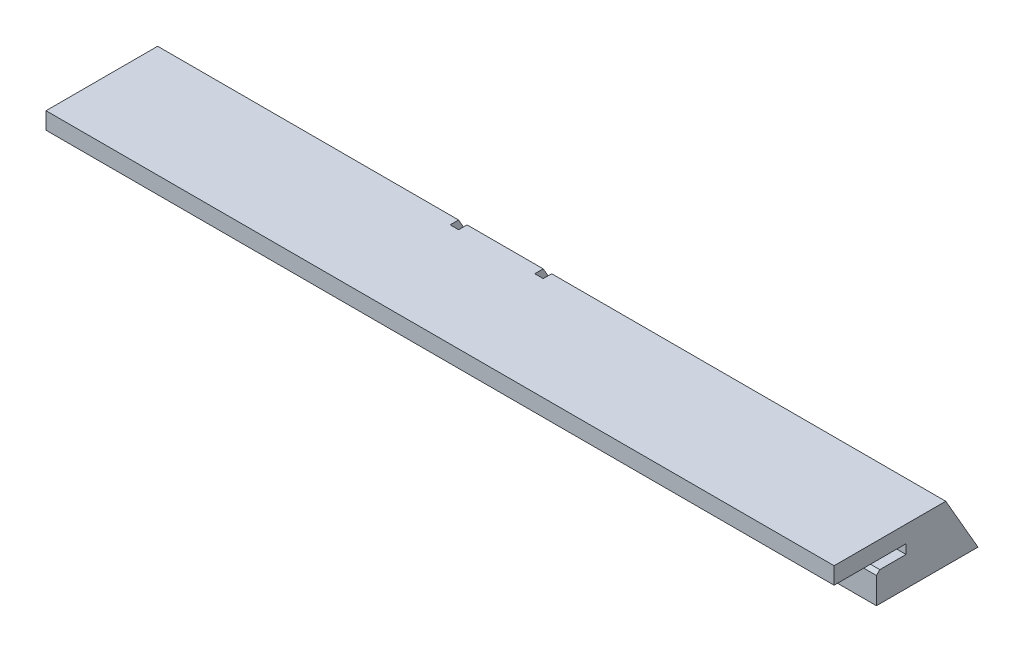
ISO-10303-21;
HEADER;
FILE_DESCRIPTION(('STEP AP214'),'2;1');
FILE_NAME('part.step','',(''),(''),'','','');
FILE_SCHEMA(('AUTOMOTIVE_DESIGN { 1 0 10303 214 1 1 1 1 }'));
ENDSEC;
DATA;
#1=APPLICATION_CONTEXT('core data for automotive mechanical design processes');
#2=APPLICATION_PROTOCOL_DEFINITION('international standard','automotive_design',2000,#1);
#3=PRODUCT_CONTEXT('',#1,'mechanical');
#4=PRODUCT('Part','Part','',(#3));
#5=PRODUCT_RELATED_PRODUCT_CATEGORY('part','',(#4));
#6=PRODUCT_DEFINITION_FORMATION('','',#4);
#7=PRODUCT_DEFINITION_CONTEXT('part definition',#1,'design');
#8=PRODUCT_DEFINITION('design','',#6,#7);
#9=PRODUCT_DEFINITION_SHAPE('','',#8);
#10=(LENGTH_UNIT() NAMED_UNIT(*) SI_UNIT(.MILLI.,.METRE.));
#11=(NAMED_UNIT(*) PLANE_ANGLE_UNIT() SI_UNIT($,.RADIAN.));
#12=(NAMED_UNIT(*) SI_UNIT($,.STERADIAN.) SOLID_ANGLE_UNIT());
#13=UNCERTAINTY_MEASURE_WITH_UNIT(LENGTH_MEASURE(1.E-05),#10,'distance_accuracy_value','');
#14=(GEOMETRIC_REPRESENTATION_CONTEXT(3) GLOBAL_UNCERTAINTY_ASSIGNED_CONTEXT((#13)) GLOBAL_UNIT_ASSIGNED_CONTEXT((#10,
#11,#12)) REPRESENTATION_CONTEXT('',''));
#15=CARTESIAN_POINT('',(0.,0.,0.));
#16=DIRECTION('',(0.,0.,1.));
#17=DIRECTION('',(1.,0.,0.));
#18=AXIS2_PLACEMENT_3D('',#15,#16,#17);
#19=CARTESIAN_POINT('',(0.,4.33012701892216,-9.50000000000006));
#20=DIRECTION('',(0.,0.499999999999995,-0.866025403784442));
#21=DIRECTION('',(0.,0.866025403784442,0.499999999999995));
#22=AXIS2_PLACEMENT_3D('',#19,#20,#21);
#23=PLANE('',#22);
#24=DIRECTION('',(0.,-0.866025403784442,-0.499999999999995));
#25=VECTOR('',#24,1.);
#26=CARTESIAN_POINT('',(46.55,6.6,-8.18948822334853));
#27=LINE('',#26,#25);
#28=CARTESIAN_POINT('',(46.55,6.6,-8.18948822334853));
#29=VERTEX_POINT('',#28);
#30=CARTESIAN_POINT('',(46.55,0.,-12.));
#31=VERTEX_POINT('',#30);
#32=EDGE_CURVE('E209',#29,#31,#27,.T.);
#33=ORIENTED_EDGE('',*,*,#32,.F.);
#34=DIRECTION('',(1.,0.,0.));
#35=VECTOR('',#34,1.);
#36=CARTESIAN_POINT('',(0.,6.6,-8.18948822334853));
#37=LINE('',#36,#35);
#38=CARTESIAN_POINT('',(93.1,6.6,-8.18948822334853));
#39=VERTEX_POINT('',#38);
#40=EDGE_CURVE('E271',#29,#39,#37,.T.);
#41=ORIENTED_EDGE('',*,*,#40,.T.);
#42=DIRECTION('',(0.,-0.866025403784442,-0.499999999999995));
#43=VECTOR('',#42,1.);
#44=CARTESIAN_POINT('',(93.1,6.6,-8.18948822334853));
#45=LINE('',#44,#43);
#46=CARTESIAN_POINT('',(93.1,0.,-12.));
#47=VERTEX_POINT('',#46);
#48=EDGE_CURVE('E275',#39,#47,#45,.T.);
#49=ORIENTED_EDGE('',*,*,#48,.T.);
#50=DIRECTION('',(-1.,0.,0.));
#51=VECTOR('',#50,1.);
#52=CARTESIAN_POINT('',(93.1,0.,-12.));
#53=LINE('',#52,#51);
#54=EDGE_CURVE('E265',#47,#31,#53,.T.);
#55=ORIENTED_EDGE('',*,*,#54,.T.);
#56=EDGE_LOOP('',(#33,#41,#49,#55));
#57=FACE_BOUND('',#56,.T.);
#58=ADVANCED_FACE('F43',(#57),#23,.T.);
#59=DIRECTION('',(0.,0.866025403784442,0.499999999999995));
#60=VECTOR('',#59,1.);
#61=CARTESIAN_POINT('',(35.55,6.60000000000001,-8.18948822334853));
#62=LINE('',#61,#60);
#63=CARTESIAN_POINT('',(35.55,0.,-12.));
#64=VERTEX_POINT('',#63);
#65=CARTESIAN_POINT('',(35.55,6.60000000000001,-8.18948822334853));
#66=VERTEX_POINT('',#65);
#67=EDGE_CURVE('E252',#64,#66,#62,.T.);
#68=ORIENTED_EDGE('',*,*,#67,.F.);
#69=CARTESIAN_POINT('',(0.,0.,-12.));
#70=VERTEX_POINT('',#69);
#71=EDGE_CURVE('E237',#64,#70,#53,.T.);
#72=ORIENTED_EDGE('',*,*,#71,.T.);
#73=DIRECTION('',(0.,0.866025403784442,0.499999999999995));
#74=VECTOR('',#73,1.);
#75=CARTESIAN_POINT('',(0.,0.,-12.));
#76=LINE('',#75,#74);
#77=CARTESIAN_POINT('',(0.,6.6,-8.18948822334853));
#78=VERTEX_POINT('',#77);
#79=EDGE_CURVE('E267',#70,#78,#76,.T.);
#80=ORIENTED_EDGE('',*,*,#79,.T.);
#81=EDGE_CURVE('E272',#78,#66,#37,.T.);
#82=ORIENTED_EDGE('',*,*,#81,.T.);
#83=EDGE_LOOP('',(#68,#72,#80,#82));
#84=FACE_BOUND('',#83,.T.);
#85=ADVANCED_FACE('F454',(#84),#23,.T.);
#86=CARTESIAN_POINT('',(0.,3.5,0.));
#87=DIRECTION('',(0.,0.,-1.));
#88=DIRECTION('',(-1.,0.,0.));
#89=AXIS2_PLACEMENT_3D('',#86,#87,#88);
#90=PLANE('',#89);
#91=DIRECTION('',(0.,-1.,0.));
#92=VECTOR('',#91,1.);
#93=CARTESIAN_POINT('',(88.1,4.6,0.));
#94=LINE('',#93,#92);
#95=CARTESIAN_POINT('',(88.1,4.6,0.));
#96=VERTEX_POINT('',#95);
#97=CARTESIAN_POINT('',(88.1,3.1,0.));
#98=VERTEX_POINT('',#97);
#99=EDGE_CURVE('E304',#96,#98,#94,.T.);
#100=ORIENTED_EDGE('',*,*,#99,.F.);
#101=DIRECTION('',(1.,0.,0.));
#102=VECTOR('',#101,1.);
#103=CARTESIAN_POINT('',(0.,4.6,0.));
#104=LINE('',#103,#102);
#105=CARTESIAN_POINT('',(76.399623113199,4.6,0.));
#106=VERTEX_POINT('',#105);
#107=EDGE_CURVE('E279',#106,#96,#104,.T.);
#108=ORIENTED_EDGE('',*,*,#107,.F.);
#109=DIRECTION('',(0.,-1.,0.));
#110=VECTOR('',#109,1.);
#111=CARTESIAN_POINT('',(76.399623113199,6.601,0.));
#112=LINE('',#111,#110);
#113=CARTESIAN_POINT('',(76.399623113199,0.,0.));
#114=VERTEX_POINT('',#113);
#115=EDGE_CURVE('E298',#114,#106,#112,.F.);
#116=ORIENTED_EDGE('',*,*,#115,.F.);
#117=DIRECTION('',(1.,0.,0.));
#118=VECTOR('',#117,1.);
#119=CARTESIAN_POINT('',(0.,0.,0.));
#120=LINE('',#119,#118);
#121=CARTESIAN_POINT('',(93.1,0.,0.));
#122=VERTEX_POINT('',#121);
#123=EDGE_CURVE('E356',#114,#122,#120,.T.);
#124=ORIENTED_EDGE('',*,*,#123,.T.);
#125=DIRECTION('',(0.,-1.,0.));
#126=VECTOR('',#125,1.);
#127=CARTESIAN_POINT('',(93.1,3.5,0.));
#128=LINE('',#127,#126);
#129=CARTESIAN_POINT('',(93.1,3.1,0.));
#130=VERTEX_POINT('',#129);
#131=EDGE_CURVE('E353',#130,#122,#128,.T.);
#132=ORIENTED_EDGE('',*,*,#131,.F.);
#133=DIRECTION('',(-1.,0.,0.));
#134=VECTOR('',#133,1.);
#135=CARTESIAN_POINT('',(0.,3.1,0.));
#136=LINE('',#135,#134);
#137=EDGE_CURVE('E368',#130,#98,#136,.T.);
#138=ORIENTED_EDGE('',*,*,#137,.T.);
#139=EDGE_LOOP('',(#100,#108,#116,#124,#132,#138));
#140=FACE_BOUND('',#139,.T.);
#141=ADVANCED_FACE('F413',(#140),#90,.F.);
#142=CARTESIAN_POINT('',(0.,3.5,0.));
#143=DIRECTION('',(0.,-1.,0.));
#144=DIRECTION('',(0.,0.,-1.));
#145=AXIS2_PLACEMENT_3D('',#142,#143,#144);
#146=PLANE('',#145);
#147=DIRECTION('',(0.,0.,-1.));
#148=VECTOR('',#147,1.);
#149=CARTESIAN_POINT('',(88.1,3.5,83.1072800661891));
#150=LINE('',#149,#148);
#151=CARTESIAN_POINT('',(88.1,3.5,-0.399999999999984));
#152=VERTEX_POINT('',#151);
#153=CARTESIAN_POINT('',(88.1,3.5,-3.5));
#154=VERTEX_POINT('',#153);
#155=EDGE_CURVE('E320',#152,#154,#150,.T.);
#156=ORIENTED_EDGE('',*,*,#155,.F.);
#157=DIRECTION('',(1.,0.,0.));
#158=VECTOR('',#157,1.);
#159=CARTESIAN_POINT('',(0.,3.5,-0.399999999999984));
#160=LINE('',#159,#158);
#161=CARTESIAN_POINT('',(93.1,3.5,-0.399999999999984));
#162=VERTEX_POINT('',#161);
#163=EDGE_CURVE('E375',#152,#162,#160,.T.);
#164=ORIENTED_EDGE('',*,*,#163,.T.);
#165=DIRECTION('',(0.,0.,-1.));
#166=VECTOR('',#165,1.);
#167=CARTESIAN_POINT('',(93.1,3.5,0.));
#168=LINE('',#167,#166);
#169=CARTESIAN_POINT('',(93.1,3.5,-3.5));
#170=VERTEX_POINT('',#169);
#171=EDGE_CURVE('E350',#162,#170,#168,.T.);
#172=ORIENTED_EDGE('',*,*,#171,.T.);
#173=DIRECTION('',(1.,0.,0.));
#174=VECTOR('',#173,1.);
#175=CARTESIAN_POINT('',(0.,3.5,-3.5));
#176=LINE('',#175,#174);
#177=EDGE_CURVE('E329',#154,#170,#176,.T.);
#178=ORIENTED_EDGE('',*,*,#177,.F.);
#179=EDGE_LOOP('',(#156,#164,#172,#178));
#180=FACE_BOUND('',#179,.T.);
#181=ADVANCED_FACE('F444',(#180),#146,.F.);
#182=DIRECTION('',(0.,0.,1.));
#183=VECTOR('',#182,1.);
#184=CARTESIAN_POINT('',(0.,3.5,0.));
#185=LINE('',#184,#183);
#186=CARTESIAN_POINT('',(0.,3.5,-3.5));
#187=VERTEX_POINT('',#186);
#188=CARTESIAN_POINT('',(0.,3.5,-0.399999999999984));
#189=VERTEX_POINT('',#188);
#190=EDGE_CURVE('E347',#187,#189,#185,.T.);
#191=ORIENTED_EDGE('',*,*,#190,.T.);
#192=DIRECTION('',(1.,0.,0.));
#193=VECTOR('',#192,1.);
#194=CARTESIAN_POINT('',(0.,3.5,-0.399999999999984));
#195=LINE('',#194,#193);
#196=CARTESIAN_POINT('',(5.,3.5,-0.399999999999984));
#197=VERTEX_POINT('',#196);
#198=EDGE_CURVE('E365',#189,#197,#195,.T.);
#199=ORIENTED_EDGE('',*,*,#198,.T.);
#200=DIRECTION('',(0.,0.,-1.));
#201=VECTOR('',#200,1.);
#202=CARTESIAN_POINT('',(5.,3.5,83.1072800661891));
#203=LINE('',#202,#201);
#204=CARTESIAN_POINT('',(5.,3.5,-3.5));
#205=VERTEX_POINT('',#204);
#206=EDGE_CURVE('E307',#197,#205,#203,.T.);
#207=ORIENTED_EDGE('',*,*,#206,.T.);
#208=EDGE_CURVE('E338',#187,#205,#176,.T.);
#209=ORIENTED_EDGE('',*,*,#208,.F.);
#210=EDGE_LOOP('',(#191,#199,#207,#209));
#211=FACE_BOUND('',#210,.T.);
#212=ADVANCED_FACE('F442',(#211),#146,.F.);
#213=CARTESIAN_POINT('',(0.,4.6,-3.5));
#214=DIRECTION('',(0.,0.,-1.));
#215=DIRECTION('',(-1.,0.,0.));
#216=AXIS2_PLACEMENT_3D('',#213,#214,#215);
#217=PLANE('',#216);
#218=DIRECTION('',(0.,1.,0.));
#219=VECTOR('',#218,1.);
#220=CARTESIAN_POINT('',(88.1,4.6,-3.5));
#221=LINE('',#220,#219);
#222=CARTESIAN_POINT('',(88.1,4.6,-3.5));
#223=VERTEX_POINT('',#222);
#224=EDGE_CURVE('E313',#154,#223,#221,.T.);
#225=ORIENTED_EDGE('',*,*,#224,.F.);
#226=ORIENTED_EDGE('',*,*,#177,.T.);
#227=DIRECTION('',(0.,-1.,0.));
#228=VECTOR('',#227,1.);
#229=CARTESIAN_POINT('',(93.1,4.6,-3.5));
#230=LINE('',#229,#228);
#231=CARTESIAN_POINT('',(93.1,4.6,-3.5));
#232=VERTEX_POINT('',#231);
#233=EDGE_CURVE('E336',#232,#170,#230,.T.);
#234=ORIENTED_EDGE('',*,*,#233,.F.);
#235=DIRECTION('',(1.,0.,0.));
#236=VECTOR('',#235,1.);
#237=CARTESIAN_POINT('',(0.,4.6,-3.5));
#238=LINE('',#237,#236);
#239=EDGE_CURVE('E337',#223,#232,#238,.T.);
#240=ORIENTED_EDGE('',*,*,#239,.F.);
#241=EDGE_LOOP('',(#225,#226,#234,#240));
#242=FACE_BOUND('',#241,.T.);
#243=ADVANCED_FACE('F424',(#242),#217,.F.);
#244=DIRECTION('',(0.,-1.,0.));
#245=VECTOR('',#244,1.);
#246=CARTESIAN_POINT('',(5.,4.6,-3.5));
#247=LINE('',#246,#245);
#248=CARTESIAN_POINT('',(5.,4.6,-3.5));
#249=VERTEX_POINT('',#248);
#250=EDGE_CURVE('E303',#249,#205,#247,.T.);
#251=ORIENTED_EDGE('',*,*,#250,.F.);
#252=CARTESIAN_POINT('',(0.,4.6,-3.5));
#253=VERTEX_POINT('',#252);
#254=EDGE_CURVE('E333',#253,#249,#238,.T.);
#255=ORIENTED_EDGE('',*,*,#254,.F.);
#256=DIRECTION('',(0.,-1.,0.));
#257=VECTOR('',#256,1.);
#258=CARTESIAN_POINT('',(0.,4.6,-3.5));
#259=LINE('',#258,#257);
#260=EDGE_CURVE('E343',#253,#187,#259,.T.);
#261=ORIENTED_EDGE('',*,*,#260,.T.);
#262=ORIENTED_EDGE('',*,*,#208,.T.);
#263=EDGE_LOOP('',(#251,#255,#261,#262));
#264=FACE_BOUND('',#263,.T.);
#265=ADVANCED_FACE('F440',(#264),#217,.F.);
#266=CARTESIAN_POINT('',(0.,4.6,0.));
#267=DIRECTION('',(0.,1.,0.));
#268=DIRECTION('',(0.,0.,1.));
#269=AXIS2_PLACEMENT_3D('',#266,#267,#268);
#270=PLANE('',#269);
#271=DIRECTION('',(0.,0.,-1.));
#272=VECTOR('',#271,1.);
#273=CARTESIAN_POINT('',(5.,4.6,83.1072800661891));
#274=LINE('',#273,#272);
#275=CARTESIAN_POINT('',(5.,4.6,0.));
#276=VERTEX_POINT('',#275);
#277=EDGE_CURVE('E315',#276,#249,#274,.T.);
#278=ORIENTED_EDGE('',*,*,#277,.F.);
#279=CARTESIAN_POINT('',(16.7003768868009,4.6,0.));
#280=VERTEX_POINT('',#279);
#281=EDGE_CURVE('E284',#276,#280,#104,.T.);
#282=ORIENTED_EDGE('',*,*,#281,.T.);
#283=CARTESIAN_POINT('',(46.55,4.6,147.));
#284=DIRECTION('',(0.,-1.,0.));
#285=DIRECTION('',(0.,0.,-1.));
#286=AXIS2_PLACEMENT_3D('',#283,#284,#285);
#287=CIRCLE('',#286,150.);
#288=EDGE_CURVE('E293',#280,#106,#287,.T.);
#289=ORIENTED_EDGE('',*,*,#288,.T.);
#290=ORIENTED_EDGE('',*,*,#107,.T.);
#291=DIRECTION('',(0.,0.,-1.));
#292=VECTOR('',#291,1.);
#293=CARTESIAN_POINT('',(88.1,4.6,83.1072800661891));
#294=LINE('',#293,#292);
#295=EDGE_CURVE('E317',#96,#223,#294,.T.);
#296=ORIENTED_EDGE('',*,*,#295,.T.);
#297=ORIENTED_EDGE('',*,*,#239,.T.);
#298=DIRECTION('',(0.,0.,-1.));
#299=VECTOR('',#298,1.);
#300=CARTESIAN_POINT('',(93.1,4.6,-10.));
#301=LINE('',#300,#299);
#302=CARTESIAN_POINT('',(93.1,4.6,5.));
#303=VERTEX_POINT('',#302);
#304=EDGE_CURVE('E326',#303,#232,#301,.T.);
#305=ORIENTED_EDGE('',*,*,#304,.F.);
#306=DIRECTION('',(1.,0.,0.));
#307=VECTOR('',#306,1.);
#308=CARTESIAN_POINT('',(0.,4.6,5.));
#309=LINE('',#308,#307);
#310=CARTESIAN_POINT('',(0.,4.6,5.));
#311=VERTEX_POINT('',#310);
#312=EDGE_CURVE('E283',#311,#303,#309,.T.);
#313=ORIENTED_EDGE('',*,*,#312,.F.);
#314=DIRECTION('',(0.,0.,1.));
#315=VECTOR('',#314,1.);
#316=CARTESIAN_POINT('',(0.,4.6,-10.));
#317=LINE('',#316,#315);
#318=EDGE_CURVE('E310',#253,#311,#317,.T.);
#319=ORIENTED_EDGE('',*,*,#318,.F.);
#320=ORIENTED_EDGE('',*,*,#254,.T.);
#321=EDGE_LOOP('',(#278,#282,#289,#290,#296,#297,#305,#313,#319,#320));
#322=FACE_BOUND('',#321,.T.);
#323=ADVANCED_FACE('F409',(#322),#270,.F.);
#324=CARTESIAN_POINT('',(0.,3.5,0.));
#325=DIRECTION('',(1.,0.,0.));
#326=DIRECTION('',(0.,0.,-1.));
#327=AXIS2_PLACEMENT_3D('',#324,#325,#326);
#328=PLANE('',#327);
#329=DIRECTION('',(0.,-1.,0.));
#330=VECTOR('',#329,1.);
#331=CARTESIAN_POINT('',(0.,3.5,0.));
#332=LINE('',#331,#330);
#333=CARTESIAN_POINT('',(0.,3.1,0.));
#334=VERTEX_POINT('',#333);
#335=CARTESIAN_POINT('',(0.,0.,0.));
#336=VERTEX_POINT('',#335);
#337=EDGE_CURVE('E363',#334,#336,#332,.T.);
#338=ORIENTED_EDGE('',*,*,#337,.F.);
#339=DIRECTION('',(0.,-0.70710678118656,0.707106781186535));
#340=VECTOR('',#339,1.);
#341=CARTESIAN_POINT('',(0.,3.5,-0.399999999999984));
#342=LINE('',#341,#340);
#343=EDGE_CURVE('E373',#334,#189,#342,.F.);
#344=ORIENTED_EDGE('',*,*,#343,.T.);
#345=ORIENTED_EDGE('',*,*,#190,.F.);
#346=ORIENTED_EDGE('',*,*,#260,.F.);
#347=ORIENTED_EDGE('',*,*,#318,.T.);
#348=DIRECTION('',(0.,-1.,0.));
#349=VECTOR('',#348,1.);
#350=CARTESIAN_POINT('',(0.,4.6,5.));
#351=LINE('',#350,#349);
#352=CARTESIAN_POINT('',(0.,6.6,5.));
#353=VERTEX_POINT('',#352);
#354=EDGE_CURVE('E280',#353,#311,#351,.T.);
#355=ORIENTED_EDGE('',*,*,#354,.F.);
#356=DIRECTION('',(0.,0.,1.));
#357=VECTOR('',#356,1.);
#358=CARTESIAN_POINT('',(0.,6.6,-10.));
#359=LINE('',#358,#357);
#360=EDGE_CURVE('E323',#78,#353,#359,.T.);
#361=ORIENTED_EDGE('',*,*,#360,.F.);
#362=ORIENTED_EDGE('',*,*,#79,.F.);
#363=DIRECTION('',(0.,0.,1.));
#364=VECTOR('',#363,1.);
#365=CARTESIAN_POINT('',(0.,0.,0.));
#366=LINE('',#365,#364);
#367=EDGE_CURVE('E346',#70,#336,#366,.T.);
#368=ORIENTED_EDGE('',*,*,#367,.T.);
#369=EDGE_LOOP('',(#338,#344,#345,#346,#347,#355,#361,#362,#368));
#370=FACE_BOUND('',#369,.T.);
#371=ADVANCED_FACE('F395',(#370),#328,.F.);
#372=DIRECTION('',(0.,-1.,0.));
#373=VECTOR('',#372,1.);
#374=CARTESIAN_POINT('',(16.7003768868009,6.601,0.));
#375=LINE('',#374,#373);
#376=CARTESIAN_POINT('',(16.7003768868009,0.,0.));
#377=VERTEX_POINT('',#376);
#378=EDGE_CURVE('E296',#280,#377,#375,.T.);
#379=ORIENTED_EDGE('',*,*,#378,.F.);
#380=ORIENTED_EDGE('',*,*,#281,.F.);
#381=DIRECTION('',(0.,1.,0.));
#382=VECTOR('',#381,1.);
#383=CARTESIAN_POINT('',(5.,4.6,0.));
#384=LINE('',#383,#382);
#385=CARTESIAN_POINT('',(5.,3.1,0.));
#386=VERTEX_POINT('',#385);
#387=EDGE_CURVE('E306',#386,#276,#384,.T.);
#388=ORIENTED_EDGE('',*,*,#387,.F.);
#389=DIRECTION('',(-1.,0.,0.));
#390=VECTOR('',#389,1.);
#391=CARTESIAN_POINT('',(0.,3.1,0.));
#392=LINE('',#391,#390);
#393=EDGE_CURVE('E371',#386,#334,#392,.T.);
#394=ORIENTED_EDGE('',*,*,#393,.T.);
#395=ORIENTED_EDGE('',*,*,#337,.T.);
#396=EDGE_CURVE('E357',#336,#377,#120,.T.);
#397=ORIENTED_EDGE('',*,*,#396,.T.);
#398=EDGE_LOOP('',(#379,#380,#388,#394,#395,#397));
#399=FACE_BOUND('',#398,.T.);
#400=ADVANCED_FACE('F392',(#399),#90,.F.);
#401=CARTESIAN_POINT('',(93.1,3.5,0.));
#402=DIRECTION('',(-1.,0.,0.));
#403=DIRECTION('',(0.,0.,1.));
#404=AXIS2_PLACEMENT_3D('',#401,#402,#403);
#405=PLANE('',#404);
#406=ORIENTED_EDGE('',*,*,#171,.F.);
#407=DIRECTION('',(0.,0.70710678118656,-0.707106781186535));
#408=VECTOR('',#407,1.);
#409=CARTESIAN_POINT('',(93.1,3.5,-0.399999999999984));
#410=LINE('',#409,#408);
#411=EDGE_CURVE('E378',#162,#130,#410,.F.);
#412=ORIENTED_EDGE('',*,*,#411,.T.);
#413=ORIENTED_EDGE('',*,*,#131,.T.);
#414=DIRECTION('',(0.,0.,-1.));
#415=VECTOR('',#414,1.);
#416=CARTESIAN_POINT('',(93.1,0.,0.));
#417=LINE('',#416,#415);
#418=EDGE_CURVE('E351',#122,#47,#417,.T.);
#419=ORIENTED_EDGE('',*,*,#418,.T.);
#420=ORIENTED_EDGE('',*,*,#48,.F.);
#421=DIRECTION('',(0.,0.,-1.));
#422=VECTOR('',#421,1.);
#423=CARTESIAN_POINT('',(93.1,6.6,-10.));
#424=LINE('',#423,#422);
#425=CARTESIAN_POINT('',(93.1,6.6,5.));
#426=VERTEX_POINT('',#425);
#427=EDGE_CURVE('E325',#426,#39,#424,.T.);
#428=ORIENTED_EDGE('',*,*,#427,.F.);
#429=DIRECTION('',(0.,1.,0.));
#430=VECTOR('',#429,1.);
#431=CARTESIAN_POINT('',(93.1,4.6,5.));
#432=LINE('',#431,#430);
#433=EDGE_CURVE('E287',#303,#426,#432,.T.);
#434=ORIENTED_EDGE('',*,*,#433,.F.);
#435=ORIENTED_EDGE('',*,*,#304,.T.);
#436=ORIENTED_EDGE('',*,*,#233,.T.);
#437=EDGE_LOOP('',(#406,#412,#413,#419,#420,#428,#434,#435,#436));
#438=FACE_BOUND('',#437,.T.);
#439=ADVANCED_FACE('F430',(#438),#405,.F.);
#440=CARTESIAN_POINT('',(0.,0.,0.));
#441=DIRECTION('',(0.,-1.,0.));
#442=DIRECTION('',(0.,0.,-1.));
#443=AXIS2_PLACEMENT_3D('',#440,#441,#442);
#444=PLANE('',#443);
#445=DIRECTION('',(0.,0.,-1.));
#446=VECTOR('',#445,1.);
#447=CARTESIAN_POINT('',(46.55,0.,-11.));
#448=LINE('',#447,#446);
#449=CARTESIAN_POINT('',(46.55,0.,-11.));
#450=VERTEX_POINT('',#449);
#451=EDGE_CURVE('E203',#450,#31,#448,.T.);
#452=ORIENTED_EDGE('',*,*,#451,.T.);
#453=ORIENTED_EDGE('',*,*,#54,.F.);
#454=ORIENTED_EDGE('',*,*,#418,.F.);
#455=ORIENTED_EDGE('',*,*,#123,.F.);
#456=CARTESIAN_POINT('',(46.55,0.,147.));
#457=DIRECTION('',(0.,-1.,0.));
#458=DIRECTION('',(0.,0.,-1.));
#459=AXIS2_PLACEMENT_3D('',#456,#457,#458);
#460=CIRCLE('',#459,150.);
#461=EDGE_CURVE('E301',#377,#114,#460,.T.);
#462=ORIENTED_EDGE('',*,*,#461,.F.);
#463=ORIENTED_EDGE('',*,*,#396,.F.);
#464=ORIENTED_EDGE('',*,*,#367,.F.);
#465=ORIENTED_EDGE('',*,*,#71,.F.);
#466=DIRECTION('',(0.,0.,-1.));
#467=VECTOR('',#466,1.);
#468=CARTESIAN_POINT('',(35.55,0.,-11.));
#469=LINE('',#468,#467);
#470=CARTESIAN_POINT('',(35.55,0.,-11.));
#471=VERTEX_POINT('',#470);
#472=EDGE_CURVE('E247',#471,#64,#469,.T.);
#473=ORIENTED_EDGE('',*,*,#472,.F.);
#474=DIRECTION('',(-1.,0.,0.));
#475=VECTOR('',#474,1.);
#476=CARTESIAN_POINT('',(36.55,0.,-11.));
#477=LINE('',#476,#475);
#478=CARTESIAN_POINT('',(36.55,0.,-11.));
#479=VERTEX_POINT('',#478);
#480=EDGE_CURVE('E258',#479,#471,#477,.T.);
#481=ORIENTED_EDGE('',*,*,#480,.F.);
#482=DIRECTION('',(0.,0.,-1.));
#483=VECTOR('',#482,1.);
#484=CARTESIAN_POINT('',(36.55,0.,-11.));
#485=LINE('',#484,#483);
#486=CARTESIAN_POINT('',(36.55,0.,-12.));
#487=VERTEX_POINT('',#486);
#488=EDGE_CURVE('E244',#479,#487,#485,.T.);
#489=ORIENTED_EDGE('',*,*,#488,.T.);
#490=CARTESIAN_POINT('',(45.55,0.,-12.));
#491=VERTEX_POINT('',#490);
#492=EDGE_CURVE('E268',#491,#487,#53,.T.);
#493=ORIENTED_EDGE('',*,*,#492,.F.);
#494=DIRECTION('',(0.,0.,-1.));
#495=VECTOR('',#494,1.);
#496=CARTESIAN_POINT('',(45.55,0.,-11.));
#497=LINE('',#496,#495);
#498=CARTESIAN_POINT('',(45.55,0.,-11.));
#499=VERTEX_POINT('',#498);
#500=EDGE_CURVE('E67',#499,#491,#497,.T.);
#501=ORIENTED_EDGE('',*,*,#500,.F.);
#502=DIRECTION('',(-1.,0.,0.));
#503=VECTOR('',#502,1.);
#504=CARTESIAN_POINT('',(46.55,0.,-11.));
#505=LINE('',#504,#503);
#506=EDGE_CURVE('E220',#450,#499,#505,.T.);
#507=ORIENTED_EDGE('',*,*,#506,.F.);
#508=EDGE_LOOP('',(#452,#453,#454,#455,#462,#463,#464,#465,#473,#481,#489,#493,#501,#507));
#509=FACE_BOUND('',#508,.T.);
#510=ADVANCED_FACE('F225',(#509),#444,.T.);
#511=CARTESIAN_POINT('',(0.,6.6,0.));
#512=DIRECTION('',(0.,1.,0.));
#513=DIRECTION('',(0.,0.,1.));
#514=AXIS2_PLACEMENT_3D('',#511,#512,#513);
#515=PLANE('',#514);
#516=DIRECTION('',(0.,0.,-1.));
#517=VECTOR('',#516,1.);
#518=CARTESIAN_POINT('',(46.55,6.6,-7.18948822334853));
#519=LINE('',#518,#517);
#520=CARTESIAN_POINT('',(46.55,6.6,-7.18948822334853));
#521=VERTEX_POINT('',#520);
#522=EDGE_CURVE('E235',#521,#29,#519,.T.);
#523=ORIENTED_EDGE('',*,*,#522,.F.);
#524=DIRECTION('',(1.,0.,0.));
#525=VECTOR('',#524,1.);
#526=CARTESIAN_POINT('',(46.55,6.6,-7.18948822334853));
#527=LINE('',#526,#525);
#528=CARTESIAN_POINT('',(45.55,6.60000000000001,-7.18948822334853));
#529=VERTEX_POINT('',#528);
#530=EDGE_CURVE('E214',#529,#521,#527,.T.);
#531=ORIENTED_EDGE('',*,*,#530,.F.);
#532=DIRECTION('',(0.,0.,-1.));
#533=VECTOR('',#532,1.);
#534=CARTESIAN_POINT('',(45.55,6.60000000000001,-7.18948822334853));
#535=LINE('',#534,#533);
#536=CARTESIAN_POINT('',(45.55,6.60000000000001,-8.18948822334853));
#537=VERTEX_POINT('',#536);
#538=EDGE_CURVE('E238',#529,#537,#535,.T.);
#539=ORIENTED_EDGE('',*,*,#538,.T.);
#540=CARTESIAN_POINT('',(36.55,6.6,-8.18948822334853));
#541=VERTEX_POINT('',#540);
#542=EDGE_CURVE('E276',#541,#537,#37,.T.);
#543=ORIENTED_EDGE('',*,*,#542,.F.);
#544=DIRECTION('',(0.,0.,-1.));
#545=VECTOR('',#544,1.);
#546=CARTESIAN_POINT('',(36.55,6.6,-7.18948822334853));
#547=LINE('',#546,#545);
#548=CARTESIAN_POINT('',(36.55,6.6,-7.18948822334853));
#549=VERTEX_POINT('',#548);
#550=EDGE_CURVE('E59',#549,#541,#547,.T.);
#551=ORIENTED_EDGE('',*,*,#550,.F.);
#552=DIRECTION('',(1.,0.,0.));
#553=VECTOR('',#552,1.);
#554=CARTESIAN_POINT('',(36.55,6.6,-7.18948822334853));
#555=LINE('',#554,#553);
#556=CARTESIAN_POINT('',(35.55,6.60000000000001,-7.18948822334853));
#557=VERTEX_POINT('',#556);
#558=EDGE_CURVE('E254',#557,#549,#555,.T.);
#559=ORIENTED_EDGE('',*,*,#558,.F.);
#560=DIRECTION('',(0.,0.,-1.));
#561=VECTOR('',#560,1.);
#562=CARTESIAN_POINT('',(35.55,6.60000000000001,-7.18948822334853));
#563=LINE('',#562,#561);
#564=EDGE_CURVE('E249',#557,#66,#563,.T.);
#565=ORIENTED_EDGE('',*,*,#564,.T.);
#566=ORIENTED_EDGE('',*,*,#81,.F.);
#567=ORIENTED_EDGE('',*,*,#360,.T.);
#568=DIRECTION('',(-1.,0.,0.));
#569=VECTOR('',#568,1.);
#570=CARTESIAN_POINT('',(0.,6.6,5.));
#571=LINE('',#570,#569);
#572=EDGE_CURVE('E290',#426,#353,#571,.T.);
#573=ORIENTED_EDGE('',*,*,#572,.F.);
#574=ORIENTED_EDGE('',*,*,#427,.T.);
#575=ORIENTED_EDGE('',*,*,#40,.F.);
#576=EDGE_LOOP('',(#523,#531,#539,#543,#551,#559,#565,#566,#567,#573,#574,#575));
#577=FACE_BOUND('',#576,.T.);
#578=ADVANCED_FACE('F486',(#577),#515,.T.);
#579=CARTESIAN_POINT('',(88.1,4.6,83.1072800661891));
#580=DIRECTION('',(-1.,0.,0.));
#581=DIRECTION('',(0.,0.,1.));
#582=AXIS2_PLACEMENT_3D('',#579,#580,#581);
#583=PLANE('',#582);
#584=ORIENTED_EDGE('',*,*,#295,.F.);
#585=ORIENTED_EDGE('',*,*,#99,.T.);
#586=DIRECTION('',(0.,-0.70710678118656,0.707106781186535));
#587=VECTOR('',#586,1.);
#588=CARTESIAN_POINT('',(88.1,-37.7036400330945,40.8036400330931));
#589=LINE('',#588,#587);
#590=EDGE_CURVE('E11',#98,#152,#589,.F.);
#591=ORIENTED_EDGE('',*,*,#590,.T.);
#592=ORIENTED_EDGE('',*,*,#155,.T.);
#593=ORIENTED_EDGE('',*,*,#224,.T.);
#594=EDGE_LOOP('',(#584,#585,#591,#592,#593));
#595=FACE_BOUND('',#594,.T.);
#596=ADVANCED_FACE('F418',(#595),#583,.F.);
#597=CARTESIAN_POINT('',(5.,4.6,83.1072800661891));
#598=DIRECTION('',(1.,0.,0.));
#599=DIRECTION('',(0.,0.,-1.));
#600=AXIS2_PLACEMENT_3D('',#597,#598,#599);
#601=PLANE('',#600);
#602=ORIENTED_EDGE('',*,*,#206,.F.);
#603=DIRECTION('',(0.,0.70710678118656,-0.707106781186535));
#604=VECTOR('',#603,1.);
#605=CARTESIAN_POINT('',(5.,-37.7036400330945,40.8036400330931));
#606=LINE('',#605,#604);
#607=EDGE_CURVE('E52',#197,#386,#606,.F.);
#608=ORIENTED_EDGE('',*,*,#607,.T.);
#609=ORIENTED_EDGE('',*,*,#387,.T.);
#610=ORIENTED_EDGE('',*,*,#277,.T.);
#611=ORIENTED_EDGE('',*,*,#250,.T.);
#612=EDGE_LOOP('',(#602,#608,#609,#610,#611));
#613=FACE_BOUND('',#612,.T.);
#614=ADVANCED_FACE('F383',(#613),#601,.F.);
#615=CARTESIAN_POINT('',(0.,3.5,-0.399999999999984));
#616=DIRECTION('',(0.,-0.707106781186535,-0.70710678118656));
#617=DIRECTION('',(1.,0.,0.));
#618=AXIS2_PLACEMENT_3D('',#615,#616,#617);
#619=PLANE('',#618);
#620=ORIENTED_EDGE('',*,*,#343,.F.);
#621=ORIENTED_EDGE('',*,*,#393,.F.);
#622=ORIENTED_EDGE('',*,*,#607,.F.);
#623=ORIENTED_EDGE('',*,*,#198,.F.);
#624=EDGE_LOOP('',(#620,#621,#622,#623));
#625=FACE_BOUND('',#624,.T.);
#626=ADVANCED_FACE('F388',(#625),#619,.F.);
#627=CARTESIAN_POINT('',(0.,3.5,-0.399999999999984));
#628=DIRECTION('',(0.,-0.707106781186535,-0.70710678118656));
#629=DIRECTION('',(1.,0.,0.));
#630=AXIS2_PLACEMENT_3D('',#627,#628,#629);
#631=PLANE('',#630);
#632=ORIENTED_EDGE('',*,*,#590,.F.);
#633=ORIENTED_EDGE('',*,*,#137,.F.);
#634=ORIENTED_EDGE('',*,*,#411,.F.);
#635=ORIENTED_EDGE('',*,*,#163,.F.);
#636=EDGE_LOOP('',(#632,#633,#634,#635));
#637=FACE_BOUND('',#636,.T.);
#638=ADVANCED_FACE('F46',(#637),#631,.F.);
#639=CARTESIAN_POINT('',(46.55,6.601,147.));
#640=DIRECTION('',(0.,-1.,0.));
#641=DIRECTION('',(0.,0.,-1.));
#642=AXIS2_PLACEMENT_3D('',#639,#640,#641);
#643=CYLINDRICAL_SURFACE('',#642,150.);
#644=ORIENTED_EDGE('',*,*,#115,.T.);
#645=ORIENTED_EDGE('',*,*,#288,.F.);
#646=ORIENTED_EDGE('',*,*,#378,.T.);
#647=ORIENTED_EDGE('',*,*,#461,.T.);
#648=EDGE_LOOP('',(#644,#645,#646,#647));
#649=FACE_BOUND('',#648,.T.);
#650=ADVANCED_FACE('F405',(#649),#643,.F.);
#651=CARTESIAN_POINT('',(0.,0.,5.));
#652=DIRECTION('',(0.,0.,-1.));
#653=DIRECTION('',(-1.,0.,0.));
#654=AXIS2_PLACEMENT_3D('',#651,#652,#653);
#655=PLANE('',#654);
#656=ORIENTED_EDGE('',*,*,#354,.T.);
#657=ORIENTED_EDGE('',*,*,#312,.T.);
#658=ORIENTED_EDGE('',*,*,#433,.T.);
#659=ORIENTED_EDGE('',*,*,#572,.T.);
#660=EDGE_LOOP('',(#656,#657,#658,#659));
#661=FACE_BOUND('',#660,.T.);
#662=ADVANCED_FACE('F434',(#661),#655,.F.);
#663=DIRECTION('',(0.,0.866025403784442,0.499999999999995));
#664=VECTOR('',#663,1.);
#665=CARTESIAN_POINT('',(45.55,6.60000000000001,-8.18948822334853));
#666=LINE('',#665,#664);
#667=EDGE_CURVE('E223',#491,#537,#666,.T.);
#668=ORIENTED_EDGE('',*,*,#667,.F.);
#669=ORIENTED_EDGE('',*,*,#492,.T.);
#670=DIRECTION('',(0.,-0.866025403784442,-0.499999999999995));
#671=VECTOR('',#670,1.);
#672=CARTESIAN_POINT('',(36.55,6.6,-8.18948822334853));
#673=LINE('',#672,#671);
#674=EDGE_CURVE('E233',#541,#487,#673,.T.);
#675=ORIENTED_EDGE('',*,*,#674,.F.);
#676=ORIENTED_EDGE('',*,*,#542,.T.);
#677=EDGE_LOOP('',(#668,#669,#675,#676));
#678=FACE_BOUND('',#677,.T.);
#679=ADVANCED_FACE('F457',(#678),#23,.T.);
#680=CARTESIAN_POINT('',(35.55,6.60000000000001,-7.18948822334853));
#681=DIRECTION('',(-1.,0.,0.));
#682=DIRECTION('',(0.,0.,1.));
#683=AXIS2_PLACEMENT_3D('',#680,#681,#682);
#684=PLANE('',#683);
#685=ORIENTED_EDGE('',*,*,#67,.T.);
#686=ORIENTED_EDGE('',*,*,#564,.F.);
#687=DIRECTION('',(0.,0.866025403784442,0.499999999999995));
#688=VECTOR('',#687,1.);
#689=CARTESIAN_POINT('',(35.55,6.60000000000001,-7.18948822334853));
#690=LINE('',#689,#688);
#691=EDGE_CURVE('E243',#471,#557,#690,.T.);
#692=ORIENTED_EDGE('',*,*,#691,.F.);
#693=ORIENTED_EDGE('',*,*,#472,.T.);
#694=EDGE_LOOP('',(#685,#686,#692,#693));
#695=FACE_BOUND('',#694,.T.);
#696=ADVANCED_FACE('F466',(#695),#684,.F.);
#697=CARTESIAN_POINT('',(36.55,6.6,-7.18948822334853));
#698=DIRECTION('',(1.,0.,0.));
#699=DIRECTION('',(0.,0.,-1.));
#700=AXIS2_PLACEMENT_3D('',#697,#698,#699);
#701=PLANE('',#700);
#702=ORIENTED_EDGE('',*,*,#674,.T.);
#703=ORIENTED_EDGE('',*,*,#488,.F.);
#704=DIRECTION('',(0.,-0.866025403784442,-0.499999999999995));
#705=VECTOR('',#704,1.);
#706=CARTESIAN_POINT('',(36.55,6.6,-7.18948822334853));
#707=LINE('',#706,#705);
#708=EDGE_CURVE('E260',#549,#479,#707,.T.);
#709=ORIENTED_EDGE('',*,*,#708,.F.);
#710=ORIENTED_EDGE('',*,*,#550,.T.);
#711=EDGE_LOOP('',(#702,#703,#709,#710));
#712=FACE_BOUND('',#711,.T.);
#713=ADVANCED_FACE('F473',(#712),#701,.F.);
#714=CARTESIAN_POINT('',(0.,5.19615242270661,-8.00000000000009));
#715=DIRECTION('',(0.,-0.499999999999995,0.866025403784442));
#716=DIRECTION('',(0.,-0.866025403784442,-0.499999999999995));
#717=AXIS2_PLACEMENT_3D('',#714,#715,#716);
#718=PLANE('',#717);
#719=ORIENTED_EDGE('',*,*,#558,.T.);
#720=ORIENTED_EDGE('',*,*,#708,.T.);
#721=ORIENTED_EDGE('',*,*,#480,.T.);
#722=ORIENTED_EDGE('',*,*,#691,.T.);
#723=EDGE_LOOP('',(#719,#720,#721,#722));
#724=FACE_BOUND('',#723,.T.);
#725=ADVANCED_FACE('F488',(#724),#718,.F.);
#726=CARTESIAN_POINT('',(46.55,6.6,-7.18948822334853));
#727=DIRECTION('',(1.,0.,0.));
#728=DIRECTION('',(0.,0.,-1.));
#729=AXIS2_PLACEMENT_3D('',#726,#727,#728);
#730=PLANE('',#729);
#731=ORIENTED_EDGE('',*,*,#32,.T.);
#732=ORIENTED_EDGE('',*,*,#451,.F.);
#733=DIRECTION('',(0.,-0.866025403784442,-0.499999999999995));
#734=VECTOR('',#733,1.);
#735=CARTESIAN_POINT('',(46.55,6.6,-7.18948822334853));
#736=LINE('',#735,#734);
#737=EDGE_CURVE('E206',#521,#450,#736,.T.);
#738=ORIENTED_EDGE('',*,*,#737,.F.);
#739=ORIENTED_EDGE('',*,*,#522,.T.);
#740=EDGE_LOOP('',(#731,#732,#738,#739));
#741=FACE_BOUND('',#740,.T.);
#742=ADVANCED_FACE('F205',(#741),#730,.F.);
#743=CARTESIAN_POINT('',(45.55,6.60000000000001,-7.18948822334853));
#744=DIRECTION('',(-1.,0.,0.));
#745=DIRECTION('',(0.,0.,1.));
#746=AXIS2_PLACEMENT_3D('',#743,#744,#745);
#747=PLANE('',#746);
#748=ORIENTED_EDGE('',*,*,#667,.T.);
#749=ORIENTED_EDGE('',*,*,#538,.F.);
#750=DIRECTION('',(0.,0.866025403784442,0.499999999999995));
#751=VECTOR('',#750,1.);
#752=CARTESIAN_POINT('',(45.55,6.60000000000001,-7.18948822334853));
#753=LINE('',#752,#751);
#754=EDGE_CURVE('E227',#499,#529,#753,.T.);
#755=ORIENTED_EDGE('',*,*,#754,.F.);
#756=ORIENTED_EDGE('',*,*,#500,.T.);
#757=EDGE_LOOP('',(#748,#749,#755,#756));
#758=FACE_BOUND('',#757,.T.);
#759=ADVANCED_FACE('F644',(#758),#747,.F.);
#760=CARTESIAN_POINT('',(0.,5.1961524227066,-8.00000000000008));
#761=DIRECTION('',(0.,0.499999999999995,-0.866025403784442));
#762=DIRECTION('',(0.,0.866025403784442,0.499999999999995));
#763=AXIS2_PLACEMENT_3D('',#760,#761,#762);
#764=PLANE('',#763);
#765=ORIENTED_EDGE('',*,*,#737,.T.);
#766=ORIENTED_EDGE('',*,*,#506,.T.);
#767=ORIENTED_EDGE('',*,*,#754,.T.);
#768=ORIENTED_EDGE('',*,*,#530,.T.);
#769=EDGE_LOOP('',(#765,#766,#767,#768));
#770=FACE_BOUND('',#769,.T.);
#771=ADVANCED_FACE('F218',(#770),#764,.T.);
#772=CLOSED_SHELL('',(#58,#85,#141,#181,#212,#243,#265,#323,#371,#400,#439,#510,#578,#596,#614,
#626,#638,#650,#662,#679,#696,#713,#725,#742,#759,#771));
#773=MANIFOLD_SOLID_BREP('B2',#772);
#774=ADVANCED_BREP_SHAPE_REPRESENTATION('',(#18,#773),#14);
#775=SHAPE_DEFINITION_REPRESENTATION(#9,#774);
ENDSEC;
END-ISO-10303-21;
